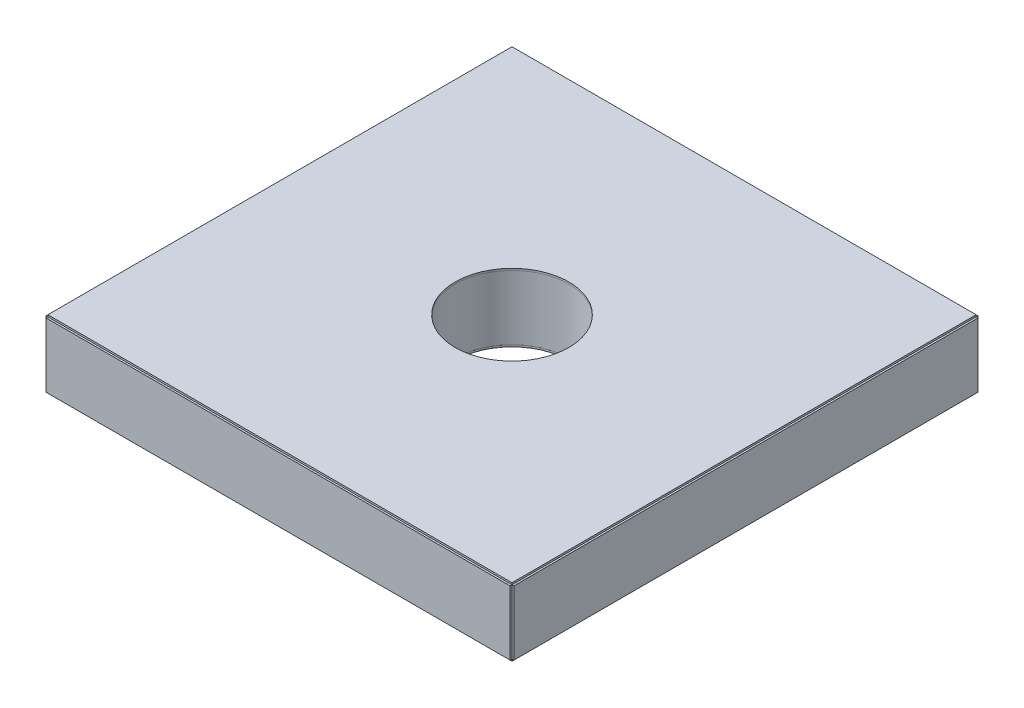
ISO-10303-21;
HEADER;
FILE_DESCRIPTION(('STEP AP214'),'2;1');
FILE_NAME('part.step','',(''),(''),'','','');
FILE_SCHEMA(('AUTOMOTIVE_DESIGN { 1 0 10303 214 1 1 1 1 }'));
ENDSEC;
DATA;
#1=APPLICATION_CONTEXT('core data for automotive mechanical design processes');
#2=APPLICATION_PROTOCOL_DEFINITION('international standard','automotive_design',2000,#1);
#3=PRODUCT_CONTEXT('',#1,'mechanical');
#4=PRODUCT('Part','Part','',(#3));
#5=PRODUCT_RELATED_PRODUCT_CATEGORY('part','',(#4));
#6=PRODUCT_DEFINITION_FORMATION('','',#4);
#7=PRODUCT_DEFINITION_CONTEXT('part definition',#1,'design');
#8=PRODUCT_DEFINITION('design','',#6,#7);
#9=PRODUCT_DEFINITION_SHAPE('','',#8);
#10=(LENGTH_UNIT() NAMED_UNIT(*) SI_UNIT(.MILLI.,.METRE.));
#11=(NAMED_UNIT(*) PLANE_ANGLE_UNIT() SI_UNIT($,.RADIAN.));
#12=(NAMED_UNIT(*) SI_UNIT($,.STERADIAN.) SOLID_ANGLE_UNIT());
#13=UNCERTAINTY_MEASURE_WITH_UNIT(LENGTH_MEASURE(1.E-05),#10,'distance_accuracy_value','');
#14=(GEOMETRIC_REPRESENTATION_CONTEXT(3) GLOBAL_UNCERTAINTY_ASSIGNED_CONTEXT((#13)) GLOBAL_UNIT_ASSIGNED_CONTEXT((#10,
#11,#12)) REPRESENTATION_CONTEXT('',''));
#15=CARTESIAN_POINT('',(0.,0.,0.));
#16=DIRECTION('',(0.,0.,1.));
#17=DIRECTION('',(1.,0.,0.));
#18=AXIS2_PLACEMENT_3D('',#15,#16,#17);
#19=CARTESIAN_POINT('',(641.1,93.98,0.));
#20=DIRECTION('',(-1.,0.,0.));
#21=DIRECTION('',(0.,0.,1.));
#22=AXIS2_PLACEMENT_3D('',#19,#20,#21);
#23=PLANE('',#22);
#24=DIRECTION('',(0.,0.,-1.));
#25=VECTOR('',#24,1.);
#26=CARTESIAN_POINT('',(641.1,91.44,0.));
#27=LINE('',#26,#25);
#28=CARTESIAN_POINT('',(641.1,91.44,0.));
#29=VERTEX_POINT('',#28);
#30=CARTESIAN_POINT('',(641.1,91.44,-641.1));
#31=VERTEX_POINT('',#30);
#32=EDGE_CURVE('E191',#29,#31,#27,.T.);
#33=ORIENTED_EDGE('',*,*,#32,.T.);
#34=DIRECTION('',(0.,-1.,0.));
#35=VECTOR('',#34,1.);
#36=CARTESIAN_POINT('',(641.1,93.98,-641.1));
#37=LINE('',#36,#35);
#38=CARTESIAN_POINT('',(641.1,93.98,-641.1));
#39=VERTEX_POINT('',#38);
#40=EDGE_CURVE('E13',#39,#31,#37,.T.);
#41=ORIENTED_EDGE('',*,*,#40,.F.);
#42=DIRECTION('',(0.,0.,-1.));
#43=VECTOR('',#42,1.);
#44=CARTESIAN_POINT('',(641.1,93.98,0.));
#45=LINE('',#44,#43);
#46=CARTESIAN_POINT('',(641.1,93.98,0.));
#47=VERTEX_POINT('',#46);
#48=EDGE_CURVE('E176',#47,#39,#45,.T.);
#49=ORIENTED_EDGE('',*,*,#48,.F.);
#50=DIRECTION('',(0.,-1.,0.));
#51=VECTOR('',#50,1.);
#52=CARTESIAN_POINT('',(641.1,93.98,0.));
#53=LINE('',#52,#51);
#54=EDGE_CURVE('E190',#47,#29,#53,.T.);
#55=ORIENTED_EDGE('',*,*,#54,.T.);
#56=EDGE_LOOP('',(#33,#41,#49,#55));
#57=FACE_BOUND('',#56,.T.);
#58=ADVANCED_FACE('F124',(#57),#23,.F.);
#59=CARTESIAN_POINT('',(0.,93.98,-641.1));
#60=DIRECTION('',(0.,0.,1.));
#61=DIRECTION('',(1.,0.,0.));
#62=AXIS2_PLACEMENT_3D('',#59,#60,#61);
#63=PLANE('',#62);
#64=DIRECTION('',(-1.,0.,0.));
#65=VECTOR('',#64,1.);
#66=CARTESIAN_POINT('',(0.,91.44,-641.1));
#67=LINE('',#66,#65);
#68=CARTESIAN_POINT('',(0.,91.44,-641.1));
#69=VERTEX_POINT('',#68);
#70=EDGE_CURVE('E180',#31,#69,#67,.T.);
#71=ORIENTED_EDGE('',*,*,#70,.T.);
#72=DIRECTION('',(0.,-1.,0.));
#73=VECTOR('',#72,1.);
#74=CARTESIAN_POINT('',(0.,93.98,-641.1));
#75=LINE('',#74,#73);
#76=CARTESIAN_POINT('',(0.,93.98,-641.1));
#77=VERTEX_POINT('',#76);
#78=EDGE_CURVE('E132',#77,#69,#75,.T.);
#79=ORIENTED_EDGE('',*,*,#78,.F.);
#80=DIRECTION('',(-1.,0.,0.));
#81=VECTOR('',#80,1.);
#82=CARTESIAN_POINT('',(0.,93.98,-641.1));
#83=LINE('',#82,#81);
#84=EDGE_CURVE('E170',#39,#77,#83,.T.);
#85=ORIENTED_EDGE('',*,*,#84,.F.);
#86=ORIENTED_EDGE('',*,*,#40,.T.);
#87=EDGE_LOOP('',(#71,#79,#85,#86));
#88=FACE_BOUND('',#87,.T.);
#89=ADVANCED_FACE('F179',(#88),#63,.F.);
#90=CARTESIAN_POINT('',(0.,93.98,0.));
#91=DIRECTION('',(1.,0.,0.));
#92=DIRECTION('',(0.,0.,-1.));
#93=AXIS2_PLACEMENT_3D('',#90,#91,#92);
#94=PLANE('',#93);
#95=DIRECTION('',(0.,0.,1.));
#96=VECTOR('',#95,1.);
#97=CARTESIAN_POINT('',(0.,91.44,0.));
#98=LINE('',#97,#96);
#99=CARTESIAN_POINT('',(0.,91.44,0.));
#100=VERTEX_POINT('',#99);
#101=EDGE_CURVE('E157',#69,#100,#98,.T.);
#102=ORIENTED_EDGE('',*,*,#101,.T.);
#103=DIRECTION('',(0.,-1.,0.));
#104=VECTOR('',#103,1.);
#105=CARTESIAN_POINT('',(0.,93.98,0.));
#106=LINE('',#105,#104);
#107=CARTESIAN_POINT('',(0.,93.98,0.));
#108=VERTEX_POINT('',#107);
#109=EDGE_CURVE('E181',#108,#100,#106,.T.);
#110=ORIENTED_EDGE('',*,*,#109,.F.);
#111=DIRECTION('',(0.,0.,1.));
#112=VECTOR('',#111,1.);
#113=CARTESIAN_POINT('',(0.,93.98,0.));
#114=LINE('',#113,#112);
#115=EDGE_CURVE('E174',#77,#108,#114,.T.);
#116=ORIENTED_EDGE('',*,*,#115,.F.);
#117=ORIENTED_EDGE('',*,*,#78,.T.);
#118=EDGE_LOOP('',(#102,#110,#116,#117));
#119=FACE_BOUND('',#118,.T.);
#120=ADVANCED_FACE('F182',(#119),#94,.F.);
#121=CARTESIAN_POINT('',(0.,93.98,0.));
#122=DIRECTION('',(0.,0.,-1.));
#123=DIRECTION('',(-1.,0.,0.));
#124=AXIS2_PLACEMENT_3D('',#121,#122,#123);
#125=PLANE('',#124);
#126=DIRECTION('',(1.,0.,0.));
#127=VECTOR('',#126,1.);
#128=CARTESIAN_POINT('',(0.,91.44,0.));
#129=LINE('',#128,#127);
#130=EDGE_CURVE('E163',#100,#29,#129,.T.);
#131=ORIENTED_EDGE('',*,*,#130,.T.);
#132=ORIENTED_EDGE('',*,*,#54,.F.);
#133=DIRECTION('',(1.,0.,0.));
#134=VECTOR('',#133,1.);
#135=CARTESIAN_POINT('',(0.,93.98,0.));
#136=LINE('',#135,#134);
#137=EDGE_CURVE('E140',#108,#47,#136,.T.);
#138=ORIENTED_EDGE('',*,*,#137,.F.);
#139=ORIENTED_EDGE('',*,*,#109,.T.);
#140=EDGE_LOOP('',(#131,#132,#138,#139));
#141=FACE_BOUND('',#140,.T.);
#142=ADVANCED_FACE('F201',(#141),#125,.F.);
#143=CARTESIAN_POINT('',(320.55,93.98,-320.55));
#144=DIRECTION('',(0.,-1.,0.));
#145=DIRECTION('',(0.,0.,-1.));
#146=AXIS2_PLACEMENT_3D('',#143,#144,#145);
#147=CYLINDRICAL_SURFACE('',#146,78.5);
#148=CARTESIAN_POINT('',(320.55,93.98,-320.55));
#149=DIRECTION('',(0.,1.,0.));
#150=DIRECTION('',(0.,0.,1.));
#151=AXIS2_PLACEMENT_3D('',#148,#149,#150);
#152=CIRCLE('',#151,78.5);
#153=CARTESIAN_POINT('',(320.55,93.98,-242.05));
#154=VERTEX_POINT('',#153);
#155=EDGE_CURVE('E184',#154,#154,#152,.F.);
#156=ORIENTED_EDGE('',*,*,#155,.F.);
#157=EDGE_LOOP('',(#156));
#158=FACE_BOUND('',#157,.T.);
#159=CARTESIAN_POINT('',(320.55,91.44,-320.55));
#160=DIRECTION('',(0.,1.,0.));
#161=DIRECTION('',(0.,0.,1.));
#162=AXIS2_PLACEMENT_3D('',#159,#160,#161);
#163=CIRCLE('',#162,78.5);
#164=CARTESIAN_POINT('',(320.55,91.44,-242.05));
#165=VERTEX_POINT('',#164);
#166=EDGE_CURVE('E197',#165,#165,#163,.F.);
#167=ORIENTED_EDGE('',*,*,#166,.T.);
#168=EDGE_LOOP('',(#167));
#169=FACE_BOUND('',#168,.T.);
#170=ADVANCED_FACE('F218',(#158,#169),#147,.F.);
#171=CARTESIAN_POINT('',(0.,93.98,0.));
#172=DIRECTION('',(0.,1.,0.));
#173=DIRECTION('',(0.,0.,1.));
#174=AXIS2_PLACEMENT_3D('',#171,#172,#173);
#175=PLANE('',#174);
#176=ORIENTED_EDGE('',*,*,#48,.T.);
#177=ORIENTED_EDGE('',*,*,#84,.T.);
#178=ORIENTED_EDGE('',*,*,#115,.T.);
#179=ORIENTED_EDGE('',*,*,#137,.T.);
#180=EDGE_LOOP('',(#176,#177,#178,#179));
#181=FACE_BOUND('',#180,.T.);
#182=ORIENTED_EDGE('',*,*,#155,.T.);
#183=EDGE_LOOP('',(#182));
#184=FACE_BOUND('',#183,.T.);
#185=ADVANCED_FACE('F171',(#181,#184),#175,.T.);
#186=CARTESIAN_POINT('',(0.,91.44,0.));
#187=DIRECTION('',(0.,1.,0.));
#188=DIRECTION('',(0.,0.,1.));
#189=AXIS2_PLACEMENT_3D('',#186,#187,#188);
#190=PLANE('',#189);
#191=ORIENTED_EDGE('',*,*,#32,.F.);
#192=ORIENTED_EDGE('',*,*,#130,.F.);
#193=ORIENTED_EDGE('',*,*,#101,.F.);
#194=ORIENTED_EDGE('',*,*,#70,.F.);
#195=EDGE_LOOP('',(#191,#192,#193,#194));
#196=FACE_BOUND('',#195,.T.);
#197=ORIENTED_EDGE('',*,*,#166,.F.);
#198=EDGE_LOOP('',(#197));
#199=FACE_BOUND('',#198,.T.);
#200=ADVANCED_FACE('F204',(#196,#199),#190,.F.);
#201=CLOSED_SHELL('',(#58,#89,#120,#142,#170,#185,#200));
#202=MANIFOLD_SOLID_BREP('B2',#201);
#203=CARTESIAN_POINT('',(-2.5400000000035,91.44,-641.099999999997));
#204=DIRECTION('',(0.,0.,1.));
#205=DIRECTION('',(1.,0.,0.));
#206=AXIS2_PLACEMENT_3D('',#203,#204,#205);
#207=PLANE('',#206);
#208=DIRECTION('',(0.,-1.,0.));
#209=VECTOR('',#208,1.);
#210=CARTESIAN_POINT('',(-3.49720252756924E-12,91.44,-641.099999999997));
#211=LINE('',#210,#209);
#212=CARTESIAN_POINT('',(-3.49720252756924E-12,91.44,-641.099999999997));
#213=VERTEX_POINT('',#212);
#214=CARTESIAN_POINT('',(-3.49720252756924E-12,2.54,-641.099999999997));
#215=VERTEX_POINT('',#214);
#216=EDGE_CURVE('E380',#213,#215,#211,.T.);
#217=ORIENTED_EDGE('',*,*,#216,.T.);
#218=DIRECTION('',(1.,0.,0.));
#219=VECTOR('',#218,1.);
#220=CARTESIAN_POINT('',(-2.5400000000035,2.54,-641.099999999997));
#221=LINE('',#220,#219);
#222=CARTESIAN_POINT('',(-2.5400000000035,2.54,-641.099999999997));
#223=VERTEX_POINT('',#222);
#224=EDGE_CURVE('E122',#223,#215,#221,.T.);
#225=ORIENTED_EDGE('',*,*,#224,.F.);
#226=DIRECTION('',(0.,-1.,0.));
#227=VECTOR('',#226,1.);
#228=CARTESIAN_POINT('',(-2.5400000000035,91.44,-641.099999999997));
#229=LINE('',#228,#227);
#230=CARTESIAN_POINT('',(-2.5400000000035,91.44,-641.099999999997));
#231=VERTEX_POINT('',#230);
#232=EDGE_CURVE('E368',#231,#223,#229,.T.);
#233=ORIENTED_EDGE('',*,*,#232,.F.);
#234=DIRECTION('',(1.,0.,0.));
#235=VECTOR('',#234,1.);
#236=CARTESIAN_POINT('',(-2.5400000000035,91.44,-641.099999999997));
#237=LINE('',#236,#235);
#238=EDGE_CURVE('E376',#231,#213,#237,.T.);
#239=ORIENTED_EDGE('',*,*,#238,.T.);
#240=EDGE_LOOP('',(#217,#225,#233,#239));
#241=FACE_BOUND('',#240,.T.);
#242=ADVANCED_FACE('F317',(#241),#207,.F.);
#243=CARTESIAN_POINT('',(-2.5400000000035,2.54,-641.099999999997));
#244=DIRECTION('',(0.,1.,0.));
#245=DIRECTION('',(-1.,0.,0.));
#246=AXIS2_PLACEMENT_3D('',#243,#244,#245);
#247=PLANE('',#246);
#248=DIRECTION('',(0.,0.,1.));
#249=VECTOR('',#248,1.);
#250=CARTESIAN_POINT('',(-3.49720252756924E-12,2.54,-641.099999999997));
#251=LINE('',#250,#249);
#252=CARTESIAN_POINT('',(3.21796353142776E-12,2.54,3.33066907387547E-12));
#253=VERTEX_POINT('',#252);
#254=EDGE_CURVE('E372',#215,#253,#251,.T.);
#255=ORIENTED_EDGE('',*,*,#254,.T.);
#256=DIRECTION('',(1.,0.,0.));
#257=VECTOR('',#256,1.);
#258=CARTESIAN_POINT('',(-2.53999999999678,2.54,3.33066907387547E-12));
#259=LINE('',#258,#257);
#260=CARTESIAN_POINT('',(-2.53999999999678,2.54,3.33066907387547E-12));
#261=VERTEX_POINT('',#260);
#262=EDGE_CURVE('E325',#261,#253,#259,.T.);
#263=ORIENTED_EDGE('',*,*,#262,.F.);
#264=DIRECTION('',(0.,0.,1.));
#265=VECTOR('',#264,1.);
#266=CARTESIAN_POINT('',(-2.5400000000035,2.54,-641.099999999997));
#267=LINE('',#266,#265);
#268=EDGE_CURVE('E363',#223,#261,#267,.T.);
#269=ORIENTED_EDGE('',*,*,#268,.F.);
#270=ORIENTED_EDGE('',*,*,#224,.T.);
#271=EDGE_LOOP('',(#255,#263,#269,#270));
#272=FACE_BOUND('',#271,.T.);
#273=ADVANCED_FACE('F371',(#272),#247,.F.);
#274=CARTESIAN_POINT('',(-2.53999999999678,2.54,3.33066907387547E-12));
#275=DIRECTION('',(0.,0.,-1.));
#276=DIRECTION('',(-1.,0.,0.));
#277=AXIS2_PLACEMENT_3D('',#274,#275,#276);
#278=PLANE('',#277);
#279=DIRECTION('',(0.,1.,0.));
#280=VECTOR('',#279,1.);
#281=CARTESIAN_POINT('',(3.21796353142776E-12,2.54,3.33066907387547E-12));
#282=LINE('',#281,#280);
#283=CARTESIAN_POINT('',(3.21796353142776E-12,91.44,3.33066907387547E-12));
#284=VERTEX_POINT('',#283);
#285=EDGE_CURVE('E350',#253,#284,#282,.T.);
#286=ORIENTED_EDGE('',*,*,#285,.T.);
#287=DIRECTION('',(1.,0.,0.));
#288=VECTOR('',#287,1.);
#289=CARTESIAN_POINT('',(-2.53999999999678,91.44,3.33066907387547E-12));
#290=LINE('',#289,#288);
#291=CARTESIAN_POINT('',(-2.53999999999678,91.44,3.33066907387547E-12));
#292=VERTEX_POINT('',#291);
#293=EDGE_CURVE('E373',#292,#284,#290,.T.);
#294=ORIENTED_EDGE('',*,*,#293,.F.);
#295=DIRECTION('',(0.,1.,0.));
#296=VECTOR('',#295,1.);
#297=CARTESIAN_POINT('',(-2.53999999999678,2.54,3.33066907387547E-12));
#298=LINE('',#297,#296);
#299=EDGE_CURVE('E366',#261,#292,#298,.T.);
#300=ORIENTED_EDGE('',*,*,#299,.F.);
#301=ORIENTED_EDGE('',*,*,#262,.T.);
#302=EDGE_LOOP('',(#286,#294,#300,#301));
#303=FACE_BOUND('',#302,.T.);
#304=ADVANCED_FACE('F374',(#303),#278,.F.);
#305=CARTESIAN_POINT('',(-2.53999999999678,91.44,3.33066907387547E-12));
#306=DIRECTION('',(0.,-1.,0.));
#307=DIRECTION('',(1.,0.,0.));
#308=AXIS2_PLACEMENT_3D('',#305,#306,#307);
#309=PLANE('',#308);
#310=DIRECTION('',(0.,0.,-1.));
#311=VECTOR('',#310,1.);
#312=CARTESIAN_POINT('',(3.21796353142776E-12,91.44,3.33066907387547E-12));
#313=LINE('',#312,#311);
#314=EDGE_CURVE('E356',#284,#213,#313,.T.);
#315=ORIENTED_EDGE('',*,*,#314,.T.);
#316=ORIENTED_EDGE('',*,*,#238,.F.);
#317=DIRECTION('',(0.,0.,-1.));
#318=VECTOR('',#317,1.);
#319=CARTESIAN_POINT('',(-2.53999999999678,91.44,3.33066907387547E-12));
#320=LINE('',#319,#318);
#321=EDGE_CURVE('E333',#292,#231,#320,.T.);
#322=ORIENTED_EDGE('',*,*,#321,.F.);
#323=ORIENTED_EDGE('',*,*,#293,.T.);
#324=EDGE_LOOP('',(#315,#316,#322,#323));
#325=FACE_BOUND('',#324,.T.);
#326=ADVANCED_FACE('F387',(#325),#309,.F.);
#327=CARTESIAN_POINT('',(-2.5400000000035,0.,-641.099999999997));
#328=DIRECTION('',(-1.,0.,0.));
#329=DIRECTION('',(0.,0.,1.));
#330=AXIS2_PLACEMENT_3D('',#327,#328,#329);
#331=PLANE('',#330);
#332=ORIENTED_EDGE('',*,*,#232,.T.);
#333=ORIENTED_EDGE('',*,*,#268,.T.);
#334=ORIENTED_EDGE('',*,*,#299,.T.);
#335=ORIENTED_EDGE('',*,*,#321,.T.);
#336=EDGE_LOOP('',(#332,#333,#334,#335));
#337=FACE_BOUND('',#336,.T.);
#338=ADVANCED_FACE('F364',(#337),#331,.T.);
#339=CARTESIAN_POINT('',(-3.49720252756924E-12,0.,-641.099999999997));
#340=DIRECTION('',(-1.,0.,0.));
#341=DIRECTION('',(0.,0.,1.));
#342=AXIS2_PLACEMENT_3D('',#339,#340,#341);
#343=PLANE('',#342);
#344=ORIENTED_EDGE('',*,*,#216,.F.);
#345=ORIENTED_EDGE('',*,*,#314,.F.);
#346=ORIENTED_EDGE('',*,*,#285,.F.);
#347=ORIENTED_EDGE('',*,*,#254,.F.);
#348=EDGE_LOOP('',(#344,#345,#346,#347));
#349=FACE_BOUND('',#348,.T.);
#350=ADVANCED_FACE('F390',(#349),#343,.F.);
#351=CLOSED_SHELL('',(#242,#273,#304,#326,#338,#350));
#352=MANIFOLD_SOLID_BREP('B7',#351);
#353=CARTESIAN_POINT('',(641.1,91.44,-643.64));
#354=DIRECTION('',(-1.,0.,0.));
#355=DIRECTION('',(0.,0.,1.));
#356=AXIS2_PLACEMENT_3D('',#353,#354,#355);
#357=PLANE('',#356);
#358=DIRECTION('',(0.,-1.,0.));
#359=VECTOR('',#358,1.);
#360=CARTESIAN_POINT('',(641.1,91.44,-641.1));
#361=LINE('',#360,#359);
#362=CARTESIAN_POINT('',(641.1,91.44,-641.1));
#363=VERTEX_POINT('',#362);
#364=CARTESIAN_POINT('',(641.1,2.54,-641.1));
#365=VERTEX_POINT('',#364);
#366=EDGE_CURVE('E538',#363,#365,#361,.T.);
#367=ORIENTED_EDGE('',*,*,#366,.T.);
#368=DIRECTION('',(0.,0.,1.));
#369=VECTOR('',#368,1.);
#370=CARTESIAN_POINT('',(641.1,2.54,-643.64));
#371=LINE('',#370,#369);
#372=CARTESIAN_POINT('',(641.1,2.54,-643.64));
#373=VERTEX_POINT('',#372);
#374=EDGE_CURVE('E315',#373,#365,#371,.T.);
#375=ORIENTED_EDGE('',*,*,#374,.F.);
#376=DIRECTION('',(0.,-1.,0.));
#377=VECTOR('',#376,1.);
#378=CARTESIAN_POINT('',(641.1,91.44,-643.64));
#379=LINE('',#378,#377);
#380=CARTESIAN_POINT('',(641.1,91.44,-643.64));
#381=VERTEX_POINT('',#380);
#382=EDGE_CURVE('E526',#381,#373,#379,.T.);
#383=ORIENTED_EDGE('',*,*,#382,.F.);
#384=DIRECTION('',(0.,0.,1.));
#385=VECTOR('',#384,1.);
#386=CARTESIAN_POINT('',(641.1,91.44,-643.64));
#387=LINE('',#386,#385);
#388=EDGE_CURVE('E534',#381,#363,#387,.T.);
#389=ORIENTED_EDGE('',*,*,#388,.T.);
#390=EDGE_LOOP('',(#367,#375,#383,#389));
#391=FACE_BOUND('',#390,.T.);
#392=ADVANCED_FACE('F475',(#391),#357,.F.);
#393=CARTESIAN_POINT('',(641.1,2.54,-643.64));
#394=DIRECTION('',(0.,1.,0.));
#395=DIRECTION('',(0.,0.,-1.));
#396=AXIS2_PLACEMENT_3D('',#393,#394,#395);
#397=PLANE('',#396);
#398=DIRECTION('',(-1.,0.,0.));
#399=VECTOR('',#398,1.);
#400=CARTESIAN_POINT('',(641.1,2.54,-641.1));
#401=LINE('',#400,#399);
#402=CARTESIAN_POINT('',(-1.11022302462516E-13,2.54,-641.1));
#403=VERTEX_POINT('',#402);
#404=EDGE_CURVE('E530',#365,#403,#401,.T.);
#405=ORIENTED_EDGE('',*,*,#404,.T.);
#406=DIRECTION('',(0.,0.,1.));
#407=VECTOR('',#406,1.);
#408=CARTESIAN_POINT('',(-1.11022302462516E-13,2.54,-643.64));
#409=LINE('',#408,#407);
#410=CARTESIAN_POINT('',(-1.11022302462516E-13,2.54,-643.64));
#411=VERTEX_POINT('',#410);
#412=EDGE_CURVE('E483',#411,#403,#409,.T.);
#413=ORIENTED_EDGE('',*,*,#412,.F.);
#414=DIRECTION('',(-1.,0.,0.));
#415=VECTOR('',#414,1.);
#416=CARTESIAN_POINT('',(641.1,2.54,-643.64));
#417=LINE('',#416,#415);
#418=EDGE_CURVE('E521',#373,#411,#417,.T.);
#419=ORIENTED_EDGE('',*,*,#418,.F.);
#420=ORIENTED_EDGE('',*,*,#374,.T.);
#421=EDGE_LOOP('',(#405,#413,#419,#420));
#422=FACE_BOUND('',#421,.T.);
#423=ADVANCED_FACE('F529',(#422),#397,.F.);
#424=CARTESIAN_POINT('',(-1.11022302462516E-13,2.54,-643.64));
#425=DIRECTION('',(1.,0.,0.));
#426=DIRECTION('',(0.,0.,-1.));
#427=AXIS2_PLACEMENT_3D('',#424,#425,#426);
#428=PLANE('',#427);
#429=DIRECTION('',(0.,1.,0.));
#430=VECTOR('',#429,1.);
#431=CARTESIAN_POINT('',(-1.11022302462516E-13,2.54,-641.1));
#432=LINE('',#431,#430);
#433=CARTESIAN_POINT('',(-1.11022302462516E-13,91.44,-641.1));
#434=VERTEX_POINT('',#433);
#435=EDGE_CURVE('E508',#403,#434,#432,.T.);
#436=ORIENTED_EDGE('',*,*,#435,.T.);
#437=DIRECTION('',(0.,0.,1.));
#438=VECTOR('',#437,1.);
#439=CARTESIAN_POINT('',(-1.11022302462516E-13,91.44,-643.64));
#440=LINE('',#439,#438);
#441=CARTESIAN_POINT('',(-1.11022302462516E-13,91.44,-643.64));
#442=VERTEX_POINT('',#441);
#443=EDGE_CURVE('E531',#442,#434,#440,.T.);
#444=ORIENTED_EDGE('',*,*,#443,.F.);
#445=DIRECTION('',(0.,1.,0.));
#446=VECTOR('',#445,1.);
#447=CARTESIAN_POINT('',(-1.11022302462516E-13,2.54,-643.64));
#448=LINE('',#447,#446);
#449=EDGE_CURVE('E524',#411,#442,#448,.T.);
#450=ORIENTED_EDGE('',*,*,#449,.F.);
#451=ORIENTED_EDGE('',*,*,#412,.T.);
#452=EDGE_LOOP('',(#436,#444,#450,#451));
#453=FACE_BOUND('',#452,.T.);
#454=ADVANCED_FACE('F532',(#453),#428,.F.);
#455=CARTESIAN_POINT('',(-1.11022302462516E-13,91.44,-643.64));
#456=DIRECTION('',(0.,-1.,0.));
#457=DIRECTION('',(0.,0.,1.));
#458=AXIS2_PLACEMENT_3D('',#455,#456,#457);
#459=PLANE('',#458);
#460=DIRECTION('',(1.,0.,0.));
#461=VECTOR('',#460,1.);
#462=CARTESIAN_POINT('',(-1.11022302462516E-13,91.44,-641.1));
#463=LINE('',#462,#461);
#464=EDGE_CURVE('E514',#434,#363,#463,.T.);
#465=ORIENTED_EDGE('',*,*,#464,.T.);
#466=ORIENTED_EDGE('',*,*,#388,.F.);
#467=DIRECTION('',(1.,0.,0.));
#468=VECTOR('',#467,1.);
#469=CARTESIAN_POINT('',(-1.11022302462516E-13,91.44,-643.64));
#470=LINE('',#469,#468);
#471=EDGE_CURVE('E491',#442,#381,#470,.T.);
#472=ORIENTED_EDGE('',*,*,#471,.F.);
#473=ORIENTED_EDGE('',*,*,#443,.T.);
#474=EDGE_LOOP('',(#465,#466,#472,#473));
#475=FACE_BOUND('',#474,.T.);
#476=ADVANCED_FACE('F545',(#475),#459,.F.);
#477=CARTESIAN_POINT('',(641.1,0.,-643.64));
#478=DIRECTION('',(0.,0.,-1.));
#479=DIRECTION('',(-1.,0.,0.));
#480=AXIS2_PLACEMENT_3D('',#477,#478,#479);
#481=PLANE('',#480);
#482=ORIENTED_EDGE('',*,*,#382,.T.);
#483=ORIENTED_EDGE('',*,*,#418,.T.);
#484=ORIENTED_EDGE('',*,*,#449,.T.);
#485=ORIENTED_EDGE('',*,*,#471,.T.);
#486=EDGE_LOOP('',(#482,#483,#484,#485));
#487=FACE_BOUND('',#486,.T.);
#488=ADVANCED_FACE('F522',(#487),#481,.T.);
#489=CARTESIAN_POINT('',(641.1,0.,-641.1));
#490=DIRECTION('',(0.,0.,-1.));
#491=DIRECTION('',(-1.,0.,0.));
#492=AXIS2_PLACEMENT_3D('',#489,#490,#491);
#493=PLANE('',#492);
#494=ORIENTED_EDGE('',*,*,#366,.F.);
#495=ORIENTED_EDGE('',*,*,#464,.F.);
#496=ORIENTED_EDGE('',*,*,#435,.F.);
#497=ORIENTED_EDGE('',*,*,#404,.F.);
#498=EDGE_LOOP('',(#494,#495,#496,#497));
#499=FACE_BOUND('',#498,.T.);
#500=ADVANCED_FACE('F548',(#499),#493,.F.);
#501=CLOSED_SHELL('',(#392,#423,#454,#476,#488,#500));
#502=MANIFOLD_SOLID_BREP('B116',#501);
#503=CARTESIAN_POINT('',(643.640000000001,91.44,-1.28562484091959E-12));
#504=DIRECTION('',(0.,0.,-1.));
#505=DIRECTION('',(-1.,0.,0.));
#506=AXIS2_PLACEMENT_3D('',#503,#504,#505);
#507=PLANE('',#506);
#508=DIRECTION('',(0.,-1.,0.));
#509=VECTOR('',#508,1.);
#510=CARTESIAN_POINT('',(641.100000000001,91.44,-1.27675647831893E-12));
#511=LINE('',#510,#509);
#512=CARTESIAN_POINT('',(641.100000000001,91.44,-1.27675647831893E-12));
#513=VERTEX_POINT('',#512);
#514=CARTESIAN_POINT('',(641.100000000001,2.54,-1.27675647831893E-12));
#515=VERTEX_POINT('',#514);
#516=EDGE_CURVE('E696',#513,#515,#511,.T.);
#517=ORIENTED_EDGE('',*,*,#516,.T.);
#518=DIRECTION('',(-1.,0.,0.));
#519=VECTOR('',#518,1.);
#520=CARTESIAN_POINT('',(643.640000000001,2.54,-1.28562484091959E-12));
#521=LINE('',#520,#519);
#522=CARTESIAN_POINT('',(643.640000000001,2.54,-1.28562484091959E-12));
#523=VERTEX_POINT('',#522);
#524=EDGE_CURVE('E473',#523,#515,#521,.T.);
#525=ORIENTED_EDGE('',*,*,#524,.F.);
#526=DIRECTION('',(0.,-1.,0.));
#527=VECTOR('',#526,1.);
#528=CARTESIAN_POINT('',(643.640000000001,91.44,-1.28562484091959E-12));
#529=LINE('',#528,#527);
#530=CARTESIAN_POINT('',(643.640000000001,91.44,-1.28562484091959E-12));
#531=VERTEX_POINT('',#530);
#532=EDGE_CURVE('E684',#531,#523,#529,.T.);
#533=ORIENTED_EDGE('',*,*,#532,.F.);
#534=DIRECTION('',(-1.,0.,0.));
#535=VECTOR('',#534,1.);
#536=CARTESIAN_POINT('',(643.640000000001,91.44,-1.28562484091959E-12));
#537=LINE('',#536,#535);
#538=EDGE_CURVE('E692',#531,#513,#537,.T.);
#539=ORIENTED_EDGE('',*,*,#538,.T.);
#540=EDGE_LOOP('',(#517,#525,#533,#539));
#541=FACE_BOUND('',#540,.T.);
#542=ADVANCED_FACE('F633',(#541),#507,.F.);
#543=CARTESIAN_POINT('',(643.640000000001,2.54,-1.28562484091959E-12));
#544=DIRECTION('',(0.,1.,0.));
#545=DIRECTION('',(1.,0.,0.));
#546=AXIS2_PLACEMENT_3D('',#543,#544,#545);
#547=PLANE('',#546);
#548=DIRECTION('',(0.,0.,-1.));
#549=VECTOR('',#548,1.);
#550=CARTESIAN_POINT('',(641.100000000001,2.54,-1.27675647831893E-12));
#551=LINE('',#550,#549);
#552=CARTESIAN_POINT('',(641.099999999999,2.54,-641.100000000001));
#553=VERTEX_POINT('',#552);
#554=EDGE_CURVE('E688',#515,#553,#551,.T.);
#555=ORIENTED_EDGE('',*,*,#554,.T.);
#556=DIRECTION('',(-1.,0.,0.));
#557=VECTOR('',#556,1.);
#558=CARTESIAN_POINT('',(643.639999999999,2.54,-641.100000000001));
#559=LINE('',#558,#557);
#560=CARTESIAN_POINT('',(643.639999999999,2.54,-641.100000000001));
#561=VERTEX_POINT('',#560);
#562=EDGE_CURVE('E641',#561,#553,#559,.T.);
#563=ORIENTED_EDGE('',*,*,#562,.F.);
#564=DIRECTION('',(0.,0.,-1.));
#565=VECTOR('',#564,1.);
#566=CARTESIAN_POINT('',(643.640000000001,2.54,-1.28562484091959E-12));
#567=LINE('',#566,#565);
#568=EDGE_CURVE('E679',#523,#561,#567,.T.);
#569=ORIENTED_EDGE('',*,*,#568,.F.);
#570=ORIENTED_EDGE('',*,*,#524,.T.);
#571=EDGE_LOOP('',(#555,#563,#569,#570));
#572=FACE_BOUND('',#571,.T.);
#573=ADVANCED_FACE('F687',(#572),#547,.F.);
#574=CARTESIAN_POINT('',(643.639999999999,2.54,-641.100000000001));
#575=DIRECTION('',(0.,0.,1.));
#576=DIRECTION('',(1.,0.,0.));
#577=AXIS2_PLACEMENT_3D('',#574,#575,#576);
#578=PLANE('',#577);
#579=DIRECTION('',(0.,1.,0.));
#580=VECTOR('',#579,1.);
#581=CARTESIAN_POINT('',(641.099999999999,2.54,-641.100000000001));
#582=LINE('',#581,#580);
#583=CARTESIAN_POINT('',(641.099999999999,91.44,-641.100000000001));
#584=VERTEX_POINT('',#583);
#585=EDGE_CURVE('E666',#553,#584,#582,.T.);
#586=ORIENTED_EDGE('',*,*,#585,.T.);
#587=DIRECTION('',(-1.,0.,0.));
#588=VECTOR('',#587,1.);
#589=CARTESIAN_POINT('',(643.639999999999,91.44,-641.100000000001));
#590=LINE('',#589,#588);
#591=CARTESIAN_POINT('',(643.639999999999,91.44,-641.100000000001));
#592=VERTEX_POINT('',#591);
#593=EDGE_CURVE('E689',#592,#584,#590,.T.);
#594=ORIENTED_EDGE('',*,*,#593,.F.);
#595=DIRECTION('',(0.,1.,0.));
#596=VECTOR('',#595,1.);
#597=CARTESIAN_POINT('',(643.639999999999,2.54,-641.100000000001));
#598=LINE('',#597,#596);
#599=EDGE_CURVE('E682',#561,#592,#598,.T.);
#600=ORIENTED_EDGE('',*,*,#599,.F.);
#601=ORIENTED_EDGE('',*,*,#562,.T.);
#602=EDGE_LOOP('',(#586,#594,#600,#601));
#603=FACE_BOUND('',#602,.T.);
#604=ADVANCED_FACE('F690',(#603),#578,.F.);
#605=CARTESIAN_POINT('',(643.639999999999,91.44,-641.100000000001));
#606=DIRECTION('',(0.,-1.,0.));
#607=DIRECTION('',(-1.,0.,0.));
#608=AXIS2_PLACEMENT_3D('',#605,#606,#607);
#609=PLANE('',#608);
#610=DIRECTION('',(0.,0.,1.));
#611=VECTOR('',#610,1.);
#612=CARTESIAN_POINT('',(641.099999999999,91.44,-641.100000000001));
#613=LINE('',#612,#611);
#614=EDGE_CURVE('E672',#584,#513,#613,.T.);
#615=ORIENTED_EDGE('',*,*,#614,.T.);
#616=ORIENTED_EDGE('',*,*,#538,.F.);
#617=DIRECTION('',(0.,0.,1.));
#618=VECTOR('',#617,1.);
#619=CARTESIAN_POINT('',(643.639999999999,91.44,-641.100000000001));
#620=LINE('',#619,#618);
#621=EDGE_CURVE('E649',#592,#531,#620,.T.);
#622=ORIENTED_EDGE('',*,*,#621,.F.);
#623=ORIENTED_EDGE('',*,*,#593,.T.);
#624=EDGE_LOOP('',(#615,#616,#622,#623));
#625=FACE_BOUND('',#624,.T.);
#626=ADVANCED_FACE('F703',(#625),#609,.F.);
#627=CARTESIAN_POINT('',(643.640000000001,0.,-1.28562484091959E-12));
#628=DIRECTION('',(1.,0.,0.));
#629=DIRECTION('',(0.,0.,-1.));
#630=AXIS2_PLACEMENT_3D('',#627,#628,#629);
#631=PLANE('',#630);
#632=ORIENTED_EDGE('',*,*,#532,.T.);
#633=ORIENTED_EDGE('',*,*,#568,.T.);
#634=ORIENTED_EDGE('',*,*,#599,.T.);
#635=ORIENTED_EDGE('',*,*,#621,.T.);
#636=EDGE_LOOP('',(#632,#633,#634,#635));
#637=FACE_BOUND('',#636,.T.);
#638=ADVANCED_FACE('F680',(#637),#631,.T.);
#639=CARTESIAN_POINT('',(641.100000000001,0.,-1.27675647831893E-12));
#640=DIRECTION('',(1.,0.,0.));
#641=DIRECTION('',(0.,0.,-1.));
#642=AXIS2_PLACEMENT_3D('',#639,#640,#641);
#643=PLANE('',#642);
#644=ORIENTED_EDGE('',*,*,#516,.F.);
#645=ORIENTED_EDGE('',*,*,#614,.F.);
#646=ORIENTED_EDGE('',*,*,#585,.F.);
#647=ORIENTED_EDGE('',*,*,#554,.F.);
#648=EDGE_LOOP('',(#644,#645,#646,#647));
#649=FACE_BOUND('',#648,.T.);
#650=ADVANCED_FACE('F706',(#649),#643,.F.);
#651=CLOSED_SHELL('',(#542,#573,#604,#626,#638,#650));
#652=MANIFOLD_SOLID_BREP('B309',#651);
#653=CARTESIAN_POINT('',(0.,91.44,2.54));
#654=DIRECTION('',(1.,0.,0.));
#655=DIRECTION('',(0.,0.,-1.));
#656=AXIS2_PLACEMENT_3D('',#653,#654,#655);
#657=PLANE('',#656);
#658=DIRECTION('',(0.,-1.,0.));
#659=VECTOR('',#658,1.);
#660=CARTESIAN_POINT('',(0.,91.44,0.));
#661=LINE('',#660,#659);
#662=CARTESIAN_POINT('',(0.,91.44,0.));
#663=VERTEX_POINT('',#662);
#664=CARTESIAN_POINT('',(0.,2.54,0.));
#665=VERTEX_POINT('',#664);
#666=EDGE_CURVE('E854',#663,#665,#661,.T.);
#667=ORIENTED_EDGE('',*,*,#666,.T.);
#668=DIRECTION('',(0.,0.,-1.));
#669=VECTOR('',#668,1.);
#670=CARTESIAN_POINT('',(0.,2.54,2.54));
#671=LINE('',#670,#669);
#672=CARTESIAN_POINT('',(0.,2.54,2.54));
#673=VERTEX_POINT('',#672);
#674=EDGE_CURVE('E631',#673,#665,#671,.T.);
#675=ORIENTED_EDGE('',*,*,#674,.F.);
#676=DIRECTION('',(0.,-1.,0.));
#677=VECTOR('',#676,1.);
#678=CARTESIAN_POINT('',(0.,91.44,2.54));
#679=LINE('',#678,#677);
#680=CARTESIAN_POINT('',(0.,91.44,2.54));
#681=VERTEX_POINT('',#680);
#682=EDGE_CURVE('E842',#681,#673,#679,.T.);
#683=ORIENTED_EDGE('',*,*,#682,.F.);
#684=DIRECTION('',(0.,0.,-1.));
#685=VECTOR('',#684,1.);
#686=CARTESIAN_POINT('',(0.,91.44,2.54));
#687=LINE('',#686,#685);
#688=EDGE_CURVE('E850',#681,#663,#687,.T.);
#689=ORIENTED_EDGE('',*,*,#688,.T.);
#690=EDGE_LOOP('',(#667,#675,#683,#689));
#691=FACE_BOUND('',#690,.T.);
#692=ADVANCED_FACE('F791',(#691),#657,.F.);
#693=CARTESIAN_POINT('',(0.,2.54,2.54));
#694=DIRECTION('',(0.,1.,0.));
#695=DIRECTION('',(0.,0.,1.));
#696=AXIS2_PLACEMENT_3D('',#693,#694,#695);
#697=PLANE('',#696);
#698=DIRECTION('',(1.,0.,0.));
#699=VECTOR('',#698,1.);
#700=CARTESIAN_POINT('',(0.,2.54,0.));
#701=LINE('',#700,#699);
#702=CARTESIAN_POINT('',(641.1,2.54,0.));
#703=VERTEX_POINT('',#702);
#704=EDGE_CURVE('E846',#665,#703,#701,.T.);
#705=ORIENTED_EDGE('',*,*,#704,.T.);
#706=DIRECTION('',(0.,0.,-1.));
#707=VECTOR('',#706,1.);
#708=CARTESIAN_POINT('',(641.1,2.54,2.54));
#709=LINE('',#708,#707);
#710=CARTESIAN_POINT('',(641.1,2.54,2.54));
#711=VERTEX_POINT('',#710);
#712=EDGE_CURVE('E799',#711,#703,#709,.T.);
#713=ORIENTED_EDGE('',*,*,#712,.F.);
#714=DIRECTION('',(1.,0.,0.));
#715=VECTOR('',#714,1.);
#716=CARTESIAN_POINT('',(0.,2.54,2.54));
#717=LINE('',#716,#715);
#718=EDGE_CURVE('E837',#673,#711,#717,.T.);
#719=ORIENTED_EDGE('',*,*,#718,.F.);
#720=ORIENTED_EDGE('',*,*,#674,.T.);
#721=EDGE_LOOP('',(#705,#713,#719,#720));
#722=FACE_BOUND('',#721,.T.);
#723=ADVANCED_FACE('F845',(#722),#697,.F.);
#724=CARTESIAN_POINT('',(641.1,2.54,2.54));
#725=DIRECTION('',(-1.,0.,0.));
#726=DIRECTION('',(0.,0.,1.));
#727=AXIS2_PLACEMENT_3D('',#724,#725,#726);
#728=PLANE('',#727);
#729=DIRECTION('',(0.,1.,0.));
#730=VECTOR('',#729,1.);
#731=CARTESIAN_POINT('',(641.1,2.54,0.));
#732=LINE('',#731,#730);
#733=CARTESIAN_POINT('',(641.1,91.44,0.));
#734=VERTEX_POINT('',#733);
#735=EDGE_CURVE('E824',#703,#734,#732,.T.);
#736=ORIENTED_EDGE('',*,*,#735,.T.);
#737=DIRECTION('',(0.,0.,-1.));
#738=VECTOR('',#737,1.);
#739=CARTESIAN_POINT('',(641.1,91.44,2.54));
#740=LINE('',#739,#738);
#741=CARTESIAN_POINT('',(641.1,91.44,2.54));
#742=VERTEX_POINT('',#741);
#743=EDGE_CURVE('E847',#742,#734,#740,.T.);
#744=ORIENTED_EDGE('',*,*,#743,.F.);
#745=DIRECTION('',(0.,1.,0.));
#746=VECTOR('',#745,1.);
#747=CARTESIAN_POINT('',(641.1,2.54,2.54));
#748=LINE('',#747,#746);
#749=EDGE_CURVE('E840',#711,#742,#748,.T.);
#750=ORIENTED_EDGE('',*,*,#749,.F.);
#751=ORIENTED_EDGE('',*,*,#712,.T.);
#752=EDGE_LOOP('',(#736,#744,#750,#751));
#753=FACE_BOUND('',#752,.T.);
#754=ADVANCED_FACE('F848',(#753),#728,.F.);
#755=CARTESIAN_POINT('',(641.1,91.44,2.54));
#756=DIRECTION('',(0.,-1.,0.));
#757=DIRECTION('',(0.,0.,-1.));
#758=AXIS2_PLACEMENT_3D('',#755,#756,#757);
#759=PLANE('',#758);
#760=DIRECTION('',(-1.,0.,0.));
#761=VECTOR('',#760,1.);
#762=CARTESIAN_POINT('',(641.1,91.44,0.));
#763=LINE('',#762,#761);
#764=EDGE_CURVE('E830',#734,#663,#763,.T.);
#765=ORIENTED_EDGE('',*,*,#764,.T.);
#766=ORIENTED_EDGE('',*,*,#688,.F.);
#767=DIRECTION('',(-1.,0.,0.));
#768=VECTOR('',#767,1.);
#769=CARTESIAN_POINT('',(641.1,91.44,2.54));
#770=LINE('',#769,#768);
#771=EDGE_CURVE('E807',#742,#681,#770,.T.);
#772=ORIENTED_EDGE('',*,*,#771,.F.);
#773=ORIENTED_EDGE('',*,*,#743,.T.);
#774=EDGE_LOOP('',(#765,#766,#772,#773));
#775=FACE_BOUND('',#774,.T.);
#776=ADVANCED_FACE('F861',(#775),#759,.F.);
#777=CARTESIAN_POINT('',(0.,0.,2.54));
#778=DIRECTION('',(0.,0.,1.));
#779=DIRECTION('',(1.,0.,0.));
#780=AXIS2_PLACEMENT_3D('',#777,#778,#779);
#781=PLANE('',#780);
#782=ORIENTED_EDGE('',*,*,#682,.T.);
#783=ORIENTED_EDGE('',*,*,#718,.T.);
#784=ORIENTED_EDGE('',*,*,#749,.T.);
#785=ORIENTED_EDGE('',*,*,#771,.T.);
#786=EDGE_LOOP('',(#782,#783,#784,#785));
#787=FACE_BOUND('',#786,.T.);
#788=ADVANCED_FACE('F838',(#787),#781,.T.);
#789=CARTESIAN_POINT('',(0.,0.,0.));
#790=DIRECTION('',(0.,0.,1.));
#791=DIRECTION('',(1.,0.,0.));
#792=AXIS2_PLACEMENT_3D('',#789,#790,#791);
#793=PLANE('',#792);
#794=ORIENTED_EDGE('',*,*,#666,.F.);
#795=ORIENTED_EDGE('',*,*,#764,.F.);
#796=ORIENTED_EDGE('',*,*,#735,.F.);
#797=ORIENTED_EDGE('',*,*,#704,.F.);
#798=EDGE_LOOP('',(#794,#795,#796,#797));
#799=FACE_BOUND('',#798,.T.);
#800=ADVANCED_FACE('F864',(#799),#793,.F.);
#801=CLOSED_SHELL('',(#692,#723,#754,#776,#788,#800));
#802=MANIFOLD_SOLID_BREP('B467',#801);
#803=CARTESIAN_POINT('',(0.,2.54,0.));
#804=DIRECTION('',(0.,1.,0.));
#805=DIRECTION('',(0.,0.,1.));
#806=AXIS2_PLACEMENT_3D('',#803,#804,#805);
#807=PLANE('',#806);
#808=CARTESIAN_POINT('',(320.55,2.54,-320.55));
#809=DIRECTION('',(0.,1.,0.));
#810=DIRECTION('',(0.,0.,1.));
#811=AXIS2_PLACEMENT_3D('',#808,#809,#810);
#812=CIRCLE('',#811,78.5);
#813=CARTESIAN_POINT('',(320.55,2.54,-242.05));
#814=VERTEX_POINT('',#813);
#815=EDGE_CURVE('E1002',#814,#814,#812,.T.);
#816=ORIENTED_EDGE('',*,*,#815,.T.);
#817=EDGE_LOOP('',(#816));
#818=FACE_BOUND('',#817,.T.);
#819=DIRECTION('',(-1.,0.,0.));
#820=VECTOR('',#819,1.);
#821=CARTESIAN_POINT('',(0.,2.54,-641.1));
#822=LINE('',#821,#820);
#823=CARTESIAN_POINT('',(641.1,2.54,-641.1));
#824=VERTEX_POINT('',#823);
#825=CARTESIAN_POINT('',(0.,2.54,-641.1));
#826=VERTEX_POINT('',#825);
#827=EDGE_CURVE('E999',#824,#826,#822,.T.);
#828=ORIENTED_EDGE('',*,*,#827,.F.);
#829=DIRECTION('',(0.,0.,-1.));
#830=VECTOR('',#829,1.);
#831=CARTESIAN_POINT('',(641.1,2.54,0.));
#832=LINE('',#831,#830);
#833=CARTESIAN_POINT('',(641.1,2.54,0.));
#834=VERTEX_POINT('',#833);
#835=EDGE_CURVE('E975',#834,#824,#832,.T.);
#836=ORIENTED_EDGE('',*,*,#835,.F.);
#837=DIRECTION('',(1.,0.,0.));
#838=VECTOR('',#837,1.);
#839=CARTESIAN_POINT('',(0.,2.54,0.));
#840=LINE('',#839,#838);
#841=CARTESIAN_POINT('',(0.,2.54,0.));
#842=VERTEX_POINT('',#841);
#843=EDGE_CURVE('E969',#842,#834,#840,.T.);
#844=ORIENTED_EDGE('',*,*,#843,.F.);
#845=DIRECTION('',(0.,0.,1.));
#846=VECTOR('',#845,1.);
#847=CARTESIAN_POINT('',(0.,2.54,0.));
#848=LINE('',#847,#846);
#849=EDGE_CURVE('E991',#826,#842,#848,.T.);
#850=ORIENTED_EDGE('',*,*,#849,.F.);
#851=EDGE_LOOP('',(#828,#836,#844,#850));
#852=FACE_BOUND('',#851,.T.);
#853=ADVANCED_FACE('F935',(#818,#852),#807,.F.);
#854=CARTESIAN_POINT('',(0.,91.44,-641.1));
#855=DIRECTION('',(0.,0.,1.));
#856=DIRECTION('',(1.,0.,0.));
#857=AXIS2_PLACEMENT_3D('',#854,#855,#856);
#858=PLANE('',#857);
#859=ORIENTED_EDGE('',*,*,#827,.T.);
#860=DIRECTION('',(0.,-1.,0.));
#861=VECTOR('',#860,1.);
#862=CARTESIAN_POINT('',(0.,91.44,-641.1));
#863=LINE('',#862,#861);
#864=CARTESIAN_POINT('',(0.,91.44,-641.1));
#865=VERTEX_POINT('',#864);
#866=EDGE_CURVE('E789',#865,#826,#863,.T.);
#867=ORIENTED_EDGE('',*,*,#866,.F.);
#868=DIRECTION('',(-1.,0.,0.));
#869=VECTOR('',#868,1.);
#870=CARTESIAN_POINT('',(0.,91.44,-641.1));
#871=LINE('',#870,#869);
#872=CARTESIAN_POINT('',(641.1,91.44,-641.1));
#873=VERTEX_POINT('',#872);
#874=EDGE_CURVE('E987',#873,#865,#871,.T.);
#875=ORIENTED_EDGE('',*,*,#874,.F.);
#876=DIRECTION('',(0.,-1.,0.));
#877=VECTOR('',#876,1.);
#878=CARTESIAN_POINT('',(641.1,91.44,-641.1));
#879=LINE('',#878,#877);
#880=EDGE_CURVE('E995',#873,#824,#879,.T.);
#881=ORIENTED_EDGE('',*,*,#880,.T.);
#882=EDGE_LOOP('',(#859,#867,#875,#881));
#883=FACE_BOUND('',#882,.T.);
#884=ADVANCED_FACE('F937',(#883),#858,.F.);
#885=CARTESIAN_POINT('',(0.,91.44,0.));
#886=DIRECTION('',(1.,0.,0.));
#887=DIRECTION('',(0.,0.,-1.));
#888=AXIS2_PLACEMENT_3D('',#885,#886,#887);
#889=PLANE('',#888);
#890=ORIENTED_EDGE('',*,*,#849,.T.);
#891=DIRECTION('',(0.,-1.,0.));
#892=VECTOR('',#891,1.);
#893=CARTESIAN_POINT('',(0.,91.44,0.));
#894=LINE('',#893,#892);
#895=CARTESIAN_POINT('',(0.,91.44,0.));
#896=VERTEX_POINT('',#895);
#897=EDGE_CURVE('E944',#896,#842,#894,.T.);
#898=ORIENTED_EDGE('',*,*,#897,.F.);
#899=DIRECTION('',(0.,0.,1.));
#900=VECTOR('',#899,1.);
#901=CARTESIAN_POINT('',(0.,91.44,0.));
#902=LINE('',#901,#900);
#903=EDGE_CURVE('E982',#865,#896,#902,.T.);
#904=ORIENTED_EDGE('',*,*,#903,.F.);
#905=ORIENTED_EDGE('',*,*,#866,.T.);
#906=EDGE_LOOP('',(#890,#898,#904,#905));
#907=FACE_BOUND('',#906,.T.);
#908=ADVANCED_FACE('F990',(#907),#889,.F.);
#909=CARTESIAN_POINT('',(0.,91.44,0.));
#910=DIRECTION('',(0.,0.,-1.));
#911=DIRECTION('',(-1.,0.,0.));
#912=AXIS2_PLACEMENT_3D('',#909,#910,#911);
#913=PLANE('',#912);
#914=ORIENTED_EDGE('',*,*,#843,.T.);
#915=DIRECTION('',(0.,-1.,0.));
#916=VECTOR('',#915,1.);
#917=CARTESIAN_POINT('',(641.1,91.44,0.));
#918=LINE('',#917,#916);
#919=CARTESIAN_POINT('',(641.1,91.44,0.));
#920=VERTEX_POINT('',#919);
#921=EDGE_CURVE('E992',#920,#834,#918,.T.);
#922=ORIENTED_EDGE('',*,*,#921,.F.);
#923=DIRECTION('',(1.,0.,0.));
#924=VECTOR('',#923,1.);
#925=CARTESIAN_POINT('',(0.,91.44,0.));
#926=LINE('',#925,#924);
#927=EDGE_CURVE('E985',#896,#920,#926,.T.);
#928=ORIENTED_EDGE('',*,*,#927,.F.);
#929=ORIENTED_EDGE('',*,*,#897,.T.);
#930=EDGE_LOOP('',(#914,#922,#928,#929));
#931=FACE_BOUND('',#930,.T.);
#932=ADVANCED_FACE('F993',(#931),#913,.F.);
#933=CARTESIAN_POINT('',(641.1,91.44,0.));
#934=DIRECTION('',(-1.,0.,0.));
#935=DIRECTION('',(0.,0.,1.));
#936=AXIS2_PLACEMENT_3D('',#933,#934,#935);
#937=PLANE('',#936);
#938=ORIENTED_EDGE('',*,*,#835,.T.);
#939=ORIENTED_EDGE('',*,*,#880,.F.);
#940=DIRECTION('',(0.,0.,-1.));
#941=VECTOR('',#940,1.);
#942=CARTESIAN_POINT('',(641.1,91.44,0.));
#943=LINE('',#942,#941);
#944=EDGE_CURVE('E952',#920,#873,#943,.T.);
#945=ORIENTED_EDGE('',*,*,#944,.F.);
#946=ORIENTED_EDGE('',*,*,#921,.T.);
#947=EDGE_LOOP('',(#938,#939,#945,#946));
#948=FACE_BOUND('',#947,.T.);
#949=ADVANCED_FACE('F1007',(#948),#937,.F.);
#950=CARTESIAN_POINT('',(0.,91.44,0.));
#951=DIRECTION('',(0.,1.,0.));
#952=DIRECTION('',(0.,0.,1.));
#953=AXIS2_PLACEMENT_3D('',#950,#951,#952);
#954=PLANE('',#953);
#955=CARTESIAN_POINT('',(320.55,91.44,-320.55));
#956=DIRECTION('',(0.,1.,0.));
#957=DIRECTION('',(0.,0.,1.));
#958=AXIS2_PLACEMENT_3D('',#955,#956,#957);
#959=CIRCLE('',#958,78.5);
#960=CARTESIAN_POINT('',(320.55,91.44,-242.05));
#961=VERTEX_POINT('',#960);
#962=EDGE_CURVE('E1014',#961,#961,#959,.T.);
#963=ORIENTED_EDGE('',*,*,#962,.F.);
#964=EDGE_LOOP('',(#963));
#965=FACE_BOUND('',#964,.T.);
#966=ORIENTED_EDGE('',*,*,#874,.T.);
#967=ORIENTED_EDGE('',*,*,#903,.T.);
#968=ORIENTED_EDGE('',*,*,#927,.T.);
#969=ORIENTED_EDGE('',*,*,#944,.T.);
#970=EDGE_LOOP('',(#966,#967,#968,#969));
#971=FACE_BOUND('',#970,.T.);
#972=ADVANCED_FACE('F983',(#965,#971),#954,.T.);
#973=CARTESIAN_POINT('',(320.55,0.,-320.55));
#974=DIRECTION('',(0.,1.,0.));
#975=DIRECTION('',(0.,0.,1.));
#976=AXIS2_PLACEMENT_3D('',#973,#974,#975);
#977=CYLINDRICAL_SURFACE('',#976,78.5);
#978=ORIENTED_EDGE('',*,*,#962,.T.);
#979=EDGE_LOOP('',(#978));
#980=FACE_BOUND('',#979,.T.);
#981=ORIENTED_EDGE('',*,*,#815,.F.);
#982=EDGE_LOOP('',(#981));
#983=FACE_BOUND('',#982,.T.);
#984=ADVANCED_FACE('F1018',(#980,#983),#977,.F.);
#985=CLOSED_SHELL('',(#853,#884,#908,#932,#949,#972,#984));
#986=MANIFOLD_SOLID_BREP('B625',#985);
#987=CARTESIAN_POINT('',(0.,2.54,0.));
#988=DIRECTION('',(1.,0.,0.));
#989=DIRECTION('',(0.,0.,-1.));
#990=AXIS2_PLACEMENT_3D('',#987,#988,#989);
#991=PLANE('',#990);
#992=DIRECTION('',(0.,0.,1.));
#993=VECTOR('',#992,1.);
#994=CARTESIAN_POINT('',(0.,0.,0.));
#995=LINE('',#994,#993);
#996=CARTESIAN_POINT('',(0.,0.,-641.1));
#997=VERTEX_POINT('',#996);
#998=CARTESIAN_POINT('',(0.,0.,0.));
#999=VERTEX_POINT('',#998);
#1000=EDGE_CURVE('E1222',#997,#999,#995,.T.);
#1001=ORIENTED_EDGE('',*,*,#1000,.T.);
#1002=DIRECTION('',(0.,-1.,0.));
#1003=VECTOR('',#1002,1.);
#1004=CARTESIAN_POINT('',(0.,2.54,0.));
#1005=LINE('',#1004,#1003);
#1006=CARTESIAN_POINT('',(0.,2.54,0.));
#1007=VERTEX_POINT('',#1006);
#1008=EDGE_CURVE('E933',#1007,#999,#1005,.T.);
#1009=ORIENTED_EDGE('',*,*,#1008,.F.);
#1010=DIRECTION('',(0.,0.,1.));
#1011=VECTOR('',#1010,1.);
#1012=CARTESIAN_POINT('',(0.,2.54,0.));
#1013=LINE('',#1012,#1011);
#1014=CARTESIAN_POINT('',(0.,2.54,-641.1));
#1015=VERTEX_POINT('',#1014);
#1016=EDGE_CURVE('E1210',#1015,#1007,#1013,.T.);
#1017=ORIENTED_EDGE('',*,*,#1016,.F.);
#1018=DIRECTION('',(0.,-1.,0.));
#1019=VECTOR('',#1018,1.);
#1020=CARTESIAN_POINT('',(0.,2.54,-641.1));
#1021=LINE('',#1020,#1019);
#1022=EDGE_CURVE('E1218',#1015,#997,#1021,.T.);
#1023=ORIENTED_EDGE('',*,*,#1022,.T.);
#1024=EDGE_LOOP('',(#1001,#1009,#1017,#1023));
#1025=FACE_BOUND('',#1024,.T.);
#1026=ADVANCED_FACE('F1159',(#1025),#991,.F.);
#1027=CARTESIAN_POINT('',(0.,2.54,0.));
#1028=DIRECTION('',(0.,0.,-1.));
#1029=DIRECTION('',(-1.,0.,0.));
#1030=AXIS2_PLACEMENT_3D('',#1027,#1028,#1029);
#1031=PLANE('',#1030);
#1032=DIRECTION('',(1.,0.,0.));
#1033=VECTOR('',#1032,1.);
#1034=CARTESIAN_POINT('',(0.,0.,0.));
#1035=LINE('',#1034,#1033);
#1036=CARTESIAN_POINT('',(641.1,0.,0.));
#1037=VERTEX_POINT('',#1036);
#1038=EDGE_CURVE('E1214',#999,#1037,#1035,.T.);
#1039=ORIENTED_EDGE('',*,*,#1038,.T.);
#1040=DIRECTION('',(0.,-1.,0.));
#1041=VECTOR('',#1040,1.);
#1042=CARTESIAN_POINT('',(641.1,2.54,0.));
#1043=LINE('',#1042,#1041);
#1044=CARTESIAN_POINT('',(641.1,2.54,0.));
#1045=VERTEX_POINT('',#1044);
#1046=EDGE_CURVE('E1167',#1045,#1037,#1043,.T.);
#1047=ORIENTED_EDGE('',*,*,#1046,.F.);
#1048=DIRECTION('',(1.,0.,0.));
#1049=VECTOR('',#1048,1.);
#1050=CARTESIAN_POINT('',(0.,2.54,0.));
#1051=LINE('',#1050,#1049);
#1052=EDGE_CURVE('E1205',#1007,#1045,#1051,.T.);
#1053=ORIENTED_EDGE('',*,*,#1052,.F.);
#1054=ORIENTED_EDGE('',*,*,#1008,.T.);
#1055=EDGE_LOOP('',(#1039,#1047,#1053,#1054));
#1056=FACE_BOUND('',#1055,.T.);
#1057=ADVANCED_FACE('F1213',(#1056),#1031,.F.);
#1058=CARTESIAN_POINT('',(641.1,2.54,0.));
#1059=DIRECTION('',(-1.,0.,0.));
#1060=DIRECTION('',(0.,0.,1.));
#1061=AXIS2_PLACEMENT_3D('',#1058,#1059,#1060);
#1062=PLANE('',#1061);
#1063=DIRECTION('',(0.,0.,-1.));
#1064=VECTOR('',#1063,1.);
#1065=CARTESIAN_POINT('',(641.1,0.,0.));
#1066=LINE('',#1065,#1064);
#1067=CARTESIAN_POINT('',(641.1,0.,-641.1));
#1068=VERTEX_POINT('',#1067);
#1069=EDGE_CURVE('E1192',#1037,#1068,#1066,.T.);
#1070=ORIENTED_EDGE('',*,*,#1069,.T.);
#1071=DIRECTION('',(0.,-1.,0.));
#1072=VECTOR('',#1071,1.);
#1073=CARTESIAN_POINT('',(641.1,2.54,-641.1));
#1074=LINE('',#1073,#1072);
#1075=CARTESIAN_POINT('',(641.1,2.54,-641.1));
#1076=VERTEX_POINT('',#1075);
#1077=EDGE_CURVE('E1215',#1076,#1068,#1074,.T.);
#1078=ORIENTED_EDGE('',*,*,#1077,.F.);
#1079=DIRECTION('',(0.,0.,-1.));
#1080=VECTOR('',#1079,1.);
#1081=CARTESIAN_POINT('',(641.1,2.54,0.));
#1082=LINE('',#1081,#1080);
#1083=EDGE_CURVE('E1208',#1045,#1076,#1082,.T.);
#1084=ORIENTED_EDGE('',*,*,#1083,.F.);
#1085=ORIENTED_EDGE('',*,*,#1046,.T.);
#1086=EDGE_LOOP('',(#1070,#1078,#1084,#1085));
#1087=FACE_BOUND('',#1086,.T.);
#1088=ADVANCED_FACE('F1216',(#1087),#1062,.F.);
#1089=CARTESIAN_POINT('',(0.,2.54,-641.1));
#1090=DIRECTION('',(0.,0.,1.));
#1091=DIRECTION('',(1.,0.,0.));
#1092=AXIS2_PLACEMENT_3D('',#1089,#1090,#1091);
#1093=PLANE('',#1092);
#1094=DIRECTION('',(-1.,0.,0.));
#1095=VECTOR('',#1094,1.);
#1096=CARTESIAN_POINT('',(0.,0.,-641.1));
#1097=LINE('',#1096,#1095);
#1098=EDGE_CURVE('E1198',#1068,#997,#1097,.T.);
#1099=ORIENTED_EDGE('',*,*,#1098,.T.);
#1100=ORIENTED_EDGE('',*,*,#1022,.F.);
#1101=DIRECTION('',(-1.,0.,0.));
#1102=VECTOR('',#1101,1.);
#1103=CARTESIAN_POINT('',(0.,2.54,-641.1));
#1104=LINE('',#1103,#1102);
#1105=EDGE_CURVE('E1175',#1076,#1015,#1104,.T.);
#1106=ORIENTED_EDGE('',*,*,#1105,.F.);
#1107=ORIENTED_EDGE('',*,*,#1077,.T.);
#1108=EDGE_LOOP('',(#1099,#1100,#1106,#1107));
#1109=FACE_BOUND('',#1108,.T.);
#1110=ADVANCED_FACE('F1230',(#1109),#1093,.F.);
#1111=CARTESIAN_POINT('',(0.,2.54,0.));
#1112=DIRECTION('',(0.,-1.,0.));
#1113=DIRECTION('',(0.,0.,-1.));
#1114=AXIS2_PLACEMENT_3D('',#1111,#1112,#1113);
#1115=PLANE('',#1114);
#1116=CARTESIAN_POINT('',(320.55,2.54,-320.55));
#1117=DIRECTION('',(0.,-1.,0.));
#1118=DIRECTION('',(0.,0.,-1.));
#1119=AXIS2_PLACEMENT_3D('',#1116,#1117,#1118);
#1120=CIRCLE('',#1119,78.5);
#1121=CARTESIAN_POINT('',(320.55,2.54,-399.05));
#1122=VERTEX_POINT('',#1121);
#1123=EDGE_CURVE('E1225',#1122,#1122,#1120,.T.);
#1124=ORIENTED_EDGE('',*,*,#1123,.T.);
#1125=EDGE_LOOP('',(#1124));
#1126=FACE_BOUND('',#1125,.T.);
#1127=ORIENTED_EDGE('',*,*,#1016,.T.);
#1128=ORIENTED_EDGE('',*,*,#1052,.T.);
#1129=ORIENTED_EDGE('',*,*,#1083,.T.);
#1130=ORIENTED_EDGE('',*,*,#1105,.T.);
#1131=EDGE_LOOP('',(#1127,#1128,#1129,#1130));
#1132=FACE_BOUND('',#1131,.T.);
#1133=ADVANCED_FACE('F1206',(#1126,#1132),#1115,.F.);
#1134=CARTESIAN_POINT('',(0.,0.,0.));
#1135=DIRECTION('',(0.,-1.,0.));
#1136=DIRECTION('',(0.,0.,-1.));
#1137=AXIS2_PLACEMENT_3D('',#1134,#1135,#1136);
#1138=PLANE('',#1137);
#1139=CARTESIAN_POINT('',(320.55,0.,-320.55));
#1140=DIRECTION('',(0.,1.,0.));
#1141=DIRECTION('',(0.,0.,1.));
#1142=AXIS2_PLACEMENT_3D('',#1139,#1140,#1141);
#1143=CIRCLE('',#1142,78.5);
#1144=CARTESIAN_POINT('',(320.55,0.,-242.05));
#1145=VERTEX_POINT('',#1144);
#1146=EDGE_CURVE('E1238',#1145,#1145,#1143,.T.);
#1147=ORIENTED_EDGE('',*,*,#1146,.T.);
#1148=EDGE_LOOP('',(#1147));
#1149=FACE_BOUND('',#1148,.T.);
#1150=ORIENTED_EDGE('',*,*,#1000,.F.);
#1151=ORIENTED_EDGE('',*,*,#1098,.F.);
#1152=ORIENTED_EDGE('',*,*,#1069,.F.);
#1153=ORIENTED_EDGE('',*,*,#1038,.F.);
#1154=EDGE_LOOP('',(#1150,#1151,#1152,#1153));
#1155=FACE_BOUND('',#1154,.T.);
#1156=ADVANCED_FACE('F1233',(#1149,#1155),#1138,.T.);
#1157=CARTESIAN_POINT('',(320.55,0.,-320.55));
#1158=DIRECTION('',(0.,1.,0.));
#1159=DIRECTION('',(0.,0.,1.));
#1160=AXIS2_PLACEMENT_3D('',#1157,#1158,#1159);
#1161=CYLINDRICAL_SURFACE('',#1160,78.5);
#1162=ORIENTED_EDGE('',*,*,#1146,.F.);
#1163=EDGE_LOOP('',(#1162));
#1164=FACE_BOUND('',#1163,.T.);
#1165=ORIENTED_EDGE('',*,*,#1123,.F.);
#1166=EDGE_LOOP('',(#1165));
#1167=FACE_BOUND('',#1166,.T.);
#1168=ADVANCED_FACE('F1243',(#1164,#1167),#1161,.F.);
#1169=CLOSED_SHELL('',(#1026,#1057,#1088,#1110,#1133,#1156,#1168));
#1170=MANIFOLD_SOLID_BREP('B783',#1169);
#1171=ADVANCED_BREP_SHAPE_REPRESENTATION('',(#18,#202,#352,#502,#652,#802,#986,#1170),#14);
#1172=SHAPE_DEFINITION_REPRESENTATION(#9,#1171);
ENDSEC;
END-ISO-10303-21;
